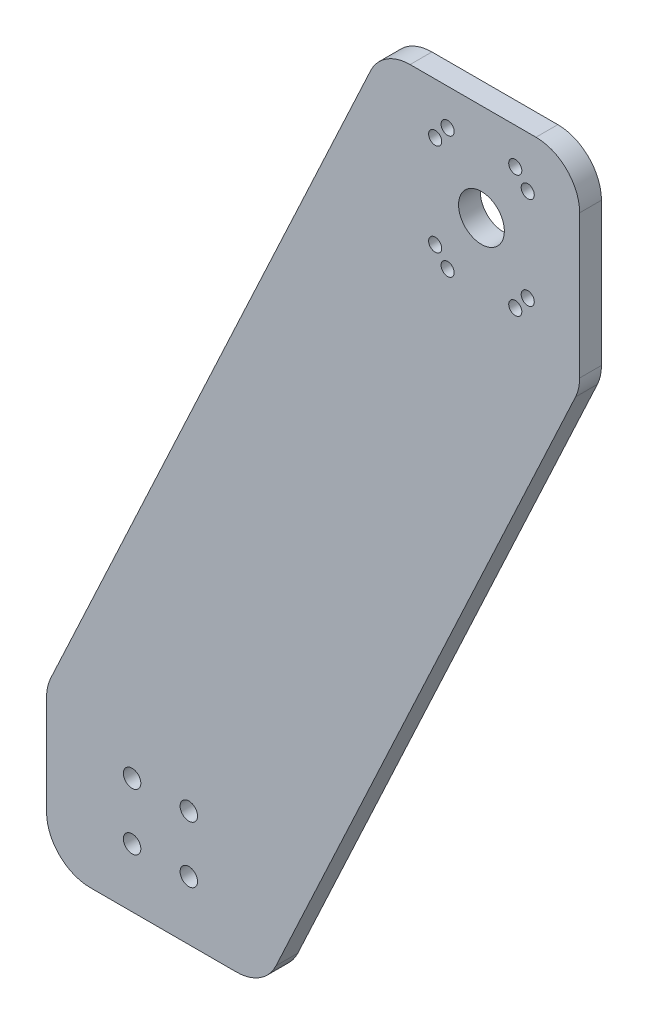
ISO-10303-21;
HEADER;
FILE_DESCRIPTION(('STEP AP214'),'2;1');
FILE_NAME('part.step','',(''),(''),'','','');
FILE_SCHEMA(('AUTOMOTIVE_DESIGN { 1 0 10303 214 1 1 1 1 }'));
ENDSEC;
DATA;
#1=APPLICATION_CONTEXT('core data for automotive mechanical design processes');
#2=APPLICATION_PROTOCOL_DEFINITION('international standard','automotive_design',2000,#1);
#3=PRODUCT_CONTEXT('',#1,'mechanical');
#4=PRODUCT('Part','Part','',(#3));
#5=PRODUCT_RELATED_PRODUCT_CATEGORY('part','',(#4));
#6=PRODUCT_DEFINITION_FORMATION('','',#4);
#7=PRODUCT_DEFINITION_CONTEXT('part definition',#1,'design');
#8=PRODUCT_DEFINITION('design','',#6,#7);
#9=PRODUCT_DEFINITION_SHAPE('','',#8);
#10=(LENGTH_UNIT() NAMED_UNIT(*) SI_UNIT(.MILLI.,.METRE.));
#11=(NAMED_UNIT(*) PLANE_ANGLE_UNIT() SI_UNIT($,.RADIAN.));
#12=(NAMED_UNIT(*) SI_UNIT($,.STERADIAN.) SOLID_ANGLE_UNIT());
#13=UNCERTAINTY_MEASURE_WITH_UNIT(LENGTH_MEASURE(1.E-05),#10,'distance_accuracy_value','');
#14=(GEOMETRIC_REPRESENTATION_CONTEXT(3) GLOBAL_UNCERTAINTY_ASSIGNED_CONTEXT((#13)) GLOBAL_UNIT_ASSIGNED_CONTEXT((#10,
#11,#12)) REPRESENTATION_CONTEXT('',''));
#15=CARTESIAN_POINT('',(0.,0.,0.));
#16=DIRECTION('',(0.,0.,1.));
#17=DIRECTION('',(1.,0.,0.));
#18=AXIS2_PLACEMENT_3D('',#15,#16,#17);
#19=CARTESIAN_POINT('',(87.0224089884993,20.,-10.));
#20=DIRECTION('',(0.,0.,1.));
#21=DIRECTION('',(1.,0.,0.));
#22=AXIS2_PLACEMENT_3D('',#19,#20,#21);
#23=CYLINDRICAL_SURFACE('',#22,20.);
#24=CARTESIAN_POINT('',(87.0224089884993,20.,0.));
#25=DIRECTION('',(0.,0.,1.));
#26=DIRECTION('',(-1.,0.,0.));
#27=AXIS2_PLACEMENT_3D('',#24,#25,#26);
#28=CIRCLE('',#27,20.);
#29=CARTESIAN_POINT('',(87.0224089884993,0.,0.));
#30=VERTEX_POINT('',#29);
#31=CARTESIAN_POINT('',(105.148564729232,11.5476347651861,0.));
#32=VERTEX_POINT('',#31);
#33=EDGE_CURVE('E153',#30,#32,#28,.T.);
#34=ORIENTED_EDGE('',*,*,#33,.F.);
#35=DIRECTION('',(0.,0.,1.));
#36=VECTOR('',#35,1.);
#37=CARTESIAN_POINT('',(87.0224089884993,0.,-10.));
#38=LINE('',#37,#36);
#39=CARTESIAN_POINT('',(87.0224089884993,0.,-10.));
#40=VERTEX_POINT('',#39);
#41=EDGE_CURVE('E11',#40,#30,#38,.T.);
#42=ORIENTED_EDGE('',*,*,#41,.F.);
#43=CARTESIAN_POINT('',(87.0224089884993,20.,-10.));
#44=DIRECTION('',(0.,0.,1.));
#45=DIRECTION('',(-1.,0.,0.));
#46=AXIS2_PLACEMENT_3D('',#43,#44,#45);
#47=CIRCLE('',#46,20.);
#48=CARTESIAN_POINT('',(105.148564729232,11.5476347651861,-10.));
#49=VERTEX_POINT('',#48);
#50=EDGE_CURVE('E186',#40,#49,#47,.T.);
#51=ORIENTED_EDGE('',*,*,#50,.T.);
#52=DIRECTION('',(0.,0.,1.));
#53=VECTOR('',#52,1.);
#54=CARTESIAN_POINT('',(105.148564729232,11.5476347651861,-10.));
#55=LINE('',#54,#53);
#56=EDGE_CURVE('E35',#49,#32,#55,.T.);
#57=ORIENTED_EDGE('',*,*,#56,.T.);
#58=EDGE_LOOP('',(#34,#42,#51,#57));
#59=FACE_BOUND('',#58,.T.);
#60=ADVANCED_FACE('F32',(#59),#23,.T.);
#61=CARTESIAN_POINT('',(20.,0.,-10.));
#62=DIRECTION('',(0.,-1.,0.));
#63=DIRECTION('',(1.,0.,0.));
#64=AXIS2_PLACEMENT_3D('',#61,#62,#63);
#65=PLANE('',#64);
#66=CARTESIAN_POINT('',(26.0112044942496,0.,-5.));
#67=DIRECTION('',(0.,-1.,0.));
#68=DIRECTION('',(-1.,0.,0.));
#69=AXIS2_PLACEMENT_3D('',#66,#67,#68);
#70=CIRCLE('',#69,2.);
#71=CARTESIAN_POINT('',(24.0112044942496,0.,-5.));
#72=VERTEX_POINT('',#71);
#73=EDGE_CURVE('E342',#72,#72,#70,.T.);
#74=ORIENTED_EDGE('',*,*,#73,.F.);
#75=EDGE_LOOP('',(#74));
#76=FACE_BOUND('',#75,.T.);
#77=CARTESIAN_POINT('',(81.0112044942496,0.,-5.));
#78=DIRECTION('',(0.,-1.,0.));
#79=DIRECTION('',(1.,0.,0.));
#80=AXIS2_PLACEMENT_3D('',#77,#78,#79);
#81=CIRCLE('',#80,2.);
#82=CARTESIAN_POINT('',(83.0112044942496,0.,-5.));
#83=VERTEX_POINT('',#82);
#84=EDGE_CURVE('E341',#83,#83,#81,.T.);
#85=ORIENTED_EDGE('',*,*,#84,.F.);
#86=EDGE_LOOP('',(#85));
#87=FACE_BOUND('',#86,.T.);
#88=CARTESIAN_POINT('',(53.5112044942496,0.,-5.));
#89=DIRECTION('',(0.,-1.,0.));
#90=DIRECTION('',(1.,0.,0.));
#91=AXIS2_PLACEMENT_3D('',#88,#89,#90);
#92=CIRCLE('',#91,2.);
#93=CARTESIAN_POINT('',(55.5112044942496,0.,-5.));
#94=VERTEX_POINT('',#93);
#95=EDGE_CURVE('E351',#94,#94,#92,.T.);
#96=ORIENTED_EDGE('',*,*,#95,.F.);
#97=EDGE_LOOP('',(#96));
#98=FACE_BOUND('',#97,.T.);
#99=DIRECTION('',(1.,0.,0.));
#100=VECTOR('',#99,1.);
#101=CARTESIAN_POINT('',(20.,0.,0.));
#102=LINE('',#101,#100);
#103=CARTESIAN_POINT('',(20.,0.,0.));
#104=VERTEX_POINT('',#103);
#105=EDGE_CURVE('E184',#104,#30,#102,.T.);
#106=ORIENTED_EDGE('',*,*,#105,.F.);
#107=DIRECTION('',(0.,0.,1.));
#108=VECTOR('',#107,1.);
#109=CARTESIAN_POINT('',(20.,0.,-10.));
#110=LINE('',#109,#108);
#111=CARTESIAN_POINT('',(20.,0.,-10.));
#112=VERTEX_POINT('',#111);
#113=EDGE_CURVE('E41',#112,#104,#110,.T.);
#114=ORIENTED_EDGE('',*,*,#113,.F.);
#115=DIRECTION('',(1.,0.,0.));
#116=VECTOR('',#115,1.);
#117=CARTESIAN_POINT('',(20.,0.,-10.));
#118=LINE('',#117,#116);
#119=EDGE_CURVE('E143',#112,#40,#118,.T.);
#120=ORIENTED_EDGE('',*,*,#119,.T.);
#121=ORIENTED_EDGE('',*,*,#41,.T.);
#122=EDGE_LOOP('',(#106,#114,#120,#121));
#123=FACE_BOUND('',#122,.T.);
#124=ADVANCED_FACE('F206',(#76,#87,#98,#123),#65,.T.);
#125=CARTESIAN_POINT('',(20.,20.,-10.));
#126=DIRECTION('',(0.,0.,1.));
#127=DIRECTION('',(1.,0.,0.));
#128=AXIS2_PLACEMENT_3D('',#125,#126,#127);
#129=CYLINDRICAL_SURFACE('',#128,20.);
#130=CARTESIAN_POINT('',(20.,20.,0.));
#131=DIRECTION('',(0.,0.,1.));
#132=DIRECTION('',(-1.,0.,0.));
#133=AXIS2_PLACEMENT_3D('',#130,#131,#132);
#134=CIRCLE('',#133,20.);
#135=CARTESIAN_POINT('',(0.,20.,0.));
#136=VERTEX_POINT('',#135);
#137=EDGE_CURVE('E130',#136,#104,#134,.T.);
#138=ORIENTED_EDGE('',*,*,#137,.F.);
#139=DIRECTION('',(0.,0.,1.));
#140=VECTOR('',#139,1.);
#141=CARTESIAN_POINT('',(0.,20.,-10.));
#142=LINE('',#141,#140);
#143=CARTESIAN_POINT('',(0.,20.,-10.));
#144=VERTEX_POINT('',#143);
#145=EDGE_CURVE('E125',#144,#136,#142,.T.);
#146=ORIENTED_EDGE('',*,*,#145,.F.);
#147=CARTESIAN_POINT('',(20.,20.,-10.));
#148=DIRECTION('',(0.,0.,1.));
#149=DIRECTION('',(-1.,0.,0.));
#150=AXIS2_PLACEMENT_3D('',#147,#148,#149);
#151=CIRCLE('',#150,20.);
#152=EDGE_CURVE('E128',#144,#112,#151,.T.);
#153=ORIENTED_EDGE('',*,*,#152,.T.);
#154=ORIENTED_EDGE('',*,*,#113,.T.);
#155=EDGE_LOOP('',(#138,#146,#153,#154));
#156=FACE_BOUND('',#155,.T.);
#157=ADVANCED_FACE('F127',(#156),#129,.T.);
#158=CARTESIAN_POINT('',(0.,65.5661067471412,-10.));
#159=DIRECTION('',(-1.,0.,0.));
#160=DIRECTION('',(0.,-1.,0.));
#161=AXIS2_PLACEMENT_3D('',#158,#159,#160);
#162=PLANE('',#161);
#163=DIRECTION('',(0.,-1.,0.));
#164=VECTOR('',#163,1.);
#165=CARTESIAN_POINT('',(0.,65.5661067471412,0.));
#166=LINE('',#165,#164);
#167=CARTESIAN_POINT('',(0.,65.5661067471412,0.));
#168=VERTEX_POINT('',#167);
#169=EDGE_CURVE('E181',#168,#136,#166,.T.);
#170=ORIENTED_EDGE('',*,*,#169,.F.);
#171=DIRECTION('',(0.,0.,1.));
#172=VECTOR('',#171,1.);
#173=CARTESIAN_POINT('',(0.,65.5661067471412,-10.));
#174=LINE('',#173,#172);
#175=CARTESIAN_POINT('',(0.,65.5661067471412,-10.));
#176=VERTEX_POINT('',#175);
#177=EDGE_CURVE('E135',#176,#168,#174,.T.);
#178=ORIENTED_EDGE('',*,*,#177,.F.);
#179=DIRECTION('',(0.,-1.,0.));
#180=VECTOR('',#179,1.);
#181=CARTESIAN_POINT('',(0.,65.5661067471412,-10.));
#182=LINE('',#181,#180);
#183=EDGE_CURVE('E141',#176,#144,#182,.T.);
#184=ORIENTED_EDGE('',*,*,#183,.T.);
#185=ORIENTED_EDGE('',*,*,#145,.T.);
#186=EDGE_LOOP('',(#170,#178,#184,#185));
#187=FACE_BOUND('',#186,.T.);
#188=ADVANCED_FACE('F145',(#187),#162,.T.);
#189=CARTESIAN_POINT('',(20.,65.5661067471412,-10.));
#190=DIRECTION('',(0.,0.,1.));
#191=DIRECTION('',(1.,0.,0.));
#192=AXIS2_PLACEMENT_3D('',#189,#190,#191);
#193=CYLINDRICAL_SURFACE('',#192,20.);
#194=CARTESIAN_POINT('',(20.,65.5661067471412,0.));
#195=DIRECTION('',(0.,0.,1.));
#196=DIRECTION('',(-1.,0.,0.));
#197=AXIS2_PLACEMENT_3D('',#194,#195,#196);
#198=CIRCLE('',#197,20.);
#199=CARTESIAN_POINT('',(1.873844259267,74.0184719819552,0.));
#200=VERTEX_POINT('',#199);
#201=EDGE_CURVE('E178',#200,#168,#198,.T.);
#202=ORIENTED_EDGE('',*,*,#201,.F.);
#203=DIRECTION('',(0.,0.,1.));
#204=VECTOR('',#203,1.);
#205=CARTESIAN_POINT('',(1.873844259267,74.0184719819552,-10.));
#206=LINE('',#205,#204);
#207=CARTESIAN_POINT('',(1.873844259267,74.0184719819552,-10.));
#208=VERTEX_POINT('',#207);
#209=EDGE_CURVE('E190',#208,#200,#206,.T.);
#210=ORIENTED_EDGE('',*,*,#209,.F.);
#211=CARTESIAN_POINT('',(20.,65.5661067471412,-10.));
#212=DIRECTION('',(0.,0.,1.));
#213=DIRECTION('',(-1.,0.,0.));
#214=AXIS2_PLACEMENT_3D('',#211,#212,#213);
#215=CIRCLE('',#214,20.);
#216=EDGE_CURVE('E146',#208,#176,#215,.T.);
#217=ORIENTED_EDGE('',*,*,#216,.T.);
#218=ORIENTED_EDGE('',*,*,#177,.T.);
#219=EDGE_LOOP('',(#202,#210,#217,#218));
#220=FACE_BOUND('',#219,.T.);
#221=ADVANCED_FACE('F222',(#220),#193,.T.);
#222=CARTESIAN_POINT('',(148.496776666565,388.452365234814,-10.));
#223=DIRECTION('',(-0.906307787036651,0.422618261740697,0.));
#224=DIRECTION('',(-0.422618261740697,-0.906307787036651,0.));
#225=AXIS2_PLACEMENT_3D('',#222,#223,#224);
#226=PLANE('',#225);
#227=DIRECTION('',(-0.422618261740697,-0.906307787036651,0.));
#228=VECTOR('',#227,1.);
#229=CARTESIAN_POINT('',(148.496776666565,388.452365234814,0.));
#230=LINE('',#229,#228);
#231=CARTESIAN_POINT('',(148.496776666565,388.452365234814,0.));
#232=VERTEX_POINT('',#231);
#233=EDGE_CURVE('E175',#232,#200,#230,.T.);
#234=ORIENTED_EDGE('',*,*,#233,.F.);
#235=DIRECTION('',(0.,0.,1.));
#236=VECTOR('',#235,1.);
#237=CARTESIAN_POINT('',(148.496776666565,388.452365234814,-10.));
#238=LINE('',#237,#236);
#239=CARTESIAN_POINT('',(148.496776666565,388.452365234814,-10.));
#240=VERTEX_POINT('',#239);
#241=EDGE_CURVE('E192',#240,#232,#238,.T.);
#242=ORIENTED_EDGE('',*,*,#241,.F.);
#243=DIRECTION('',(-0.422618261740697,-0.906307787036651,0.));
#244=VECTOR('',#243,1.);
#245=CARTESIAN_POINT('',(148.496776666565,388.452365234814,-10.));
#246=LINE('',#245,#244);
#247=EDGE_CURVE('E148',#240,#208,#246,.T.);
#248=ORIENTED_EDGE('',*,*,#247,.T.);
#249=ORIENTED_EDGE('',*,*,#209,.T.);
#250=EDGE_LOOP('',(#234,#242,#248,#249));
#251=FACE_BOUND('',#250,.T.);
#252=ADVANCED_FACE('F225',(#251),#226,.T.);
#253=CARTESIAN_POINT('',(166.622932407298,380.,-10.));
#254=DIRECTION('',(0.,0.,1.));
#255=DIRECTION('',(1.,0.,0.));
#256=AXIS2_PLACEMENT_3D('',#253,#254,#255);
#257=CYLINDRICAL_SURFACE('',#256,20.0000000000001);
#258=CARTESIAN_POINT('',(166.622932407298,380.,0.));
#259=DIRECTION('',(0.,0.,1.));
#260=DIRECTION('',(1.,0.,0.));
#261=AXIS2_PLACEMENT_3D('',#258,#259,#260);
#262=CIRCLE('',#261,20.0000000000001);
#263=CARTESIAN_POINT('',(166.622932407298,400.,0.));
#264=VERTEX_POINT('',#263);
#265=EDGE_CURVE('E172',#264,#232,#262,.T.);
#266=ORIENTED_EDGE('',*,*,#265,.F.);
#267=DIRECTION('',(0.,0.,1.));
#268=VECTOR('',#267,1.);
#269=CARTESIAN_POINT('',(166.622932407298,400.,-10.));
#270=LINE('',#269,#268);
#271=CARTESIAN_POINT('',(166.622932407298,400.,-10.));
#272=VERTEX_POINT('',#271);
#273=EDGE_CURVE('E194',#272,#264,#270,.T.);
#274=ORIENTED_EDGE('',*,*,#273,.F.);
#275=CARTESIAN_POINT('',(166.622932407298,380.,-10.));
#276=DIRECTION('',(0.,0.,1.));
#277=DIRECTION('',(1.,0.,0.));
#278=AXIS2_PLACEMENT_3D('',#275,#276,#277);
#279=CIRCLE('',#278,20.0000000000001);
#280=EDGE_CURVE('E449',#272,#240,#279,.T.);
#281=ORIENTED_EDGE('',*,*,#280,.T.);
#282=ORIENTED_EDGE('',*,*,#241,.T.);
#283=EDGE_LOOP('',(#266,#274,#281,#282));
#284=FACE_BOUND('',#283,.T.);
#285=ADVANCED_FACE('F229',(#284),#257,.T.);
#286=CARTESIAN_POINT('',(224.319188232698,400.,-10.));
#287=DIRECTION('',(0.,1.,0.));
#288=DIRECTION('',(-1.,0.,0.));
#289=AXIS2_PLACEMENT_3D('',#286,#287,#288);
#290=PLANE('',#289);
#291=DIRECTION('',(-1.,0.,0.));
#292=VECTOR('',#291,1.);
#293=CARTESIAN_POINT('',(224.319188232698,400.,0.));
#294=LINE('',#293,#292);
#295=CARTESIAN_POINT('',(224.319188232698,400.,0.));
#296=VERTEX_POINT('',#295);
#297=EDGE_CURVE('E169',#296,#264,#294,.T.);
#298=ORIENTED_EDGE('',*,*,#297,.F.);
#299=DIRECTION('',(0.,0.,1.));
#300=VECTOR('',#299,1.);
#301=CARTESIAN_POINT('',(224.319188232698,400.,-10.));
#302=LINE('',#301,#300);
#303=CARTESIAN_POINT('',(224.319188232698,400.,-10.));
#304=VERTEX_POINT('',#303);
#305=EDGE_CURVE('E196',#304,#296,#302,.T.);
#306=ORIENTED_EDGE('',*,*,#305,.F.);
#307=DIRECTION('',(-1.,0.,0.));
#308=VECTOR('',#307,1.);
#309=CARTESIAN_POINT('',(224.319188232698,400.,-10.));
#310=LINE('',#309,#308);
#311=EDGE_CURVE('E446',#304,#272,#310,.T.);
#312=ORIENTED_EDGE('',*,*,#311,.T.);
#313=ORIENTED_EDGE('',*,*,#273,.T.);
#314=EDGE_LOOP('',(#298,#306,#312,#313));
#315=FACE_BOUND('',#314,.T.);
#316=ADVANCED_FACE('F233',(#315),#290,.T.);
#317=CARTESIAN_POINT('',(224.319188232698,380.,-10.));
#318=DIRECTION('',(0.,0.,1.));
#319=DIRECTION('',(1.,0.,0.));
#320=AXIS2_PLACEMENT_3D('',#317,#318,#319);
#321=CYLINDRICAL_SURFACE('',#320,20.);
#322=CARTESIAN_POINT('',(224.319188232698,380.,0.));
#323=DIRECTION('',(0.,0.,1.));
#324=DIRECTION('',(1.,0.,0.));
#325=AXIS2_PLACEMENT_3D('',#322,#323,#324);
#326=CIRCLE('',#325,20.);
#327=CARTESIAN_POINT('',(244.319188232698,380.,0.));
#328=VERTEX_POINT('',#327);
#329=EDGE_CURVE('E166',#328,#296,#326,.T.);
#330=ORIENTED_EDGE('',*,*,#329,.F.);
#331=DIRECTION('',(0.,0.,1.));
#332=VECTOR('',#331,1.);
#333=CARTESIAN_POINT('',(244.319188232698,380.,-10.));
#334=LINE('',#333,#332);
#335=CARTESIAN_POINT('',(244.319188232698,380.,-10.));
#336=VERTEX_POINT('',#335);
#337=EDGE_CURVE('E198',#336,#328,#334,.T.);
#338=ORIENTED_EDGE('',*,*,#337,.F.);
#339=CARTESIAN_POINT('',(224.319188232698,380.,-10.));
#340=DIRECTION('',(0.,0.,1.));
#341=DIRECTION('',(1.,0.,0.));
#342=AXIS2_PLACEMENT_3D('',#339,#340,#341);
#343=CIRCLE('',#342,20.);
#344=EDGE_CURVE('E443',#336,#304,#343,.T.);
#345=ORIENTED_EDGE('',*,*,#344,.T.);
#346=ORIENTED_EDGE('',*,*,#305,.T.);
#347=EDGE_LOOP('',(#330,#338,#345,#346));
#348=FACE_BOUND('',#347,.T.);
#349=ADVANCED_FACE('F237',(#348),#321,.T.);
#350=CARTESIAN_POINT('',(244.319188232698,314.433893252859,-10.));
#351=DIRECTION('',(1.,0.,0.));
#352=DIRECTION('',(0.,0.,-1.));
#353=AXIS2_PLACEMENT_3D('',#350,#351,#352);
#354=PLANE('',#353);
#355=DIRECTION('',(0.,1.,0.));
#356=VECTOR('',#355,1.);
#357=CARTESIAN_POINT('',(244.319188232698,314.433893252859,0.));
#358=LINE('',#357,#356);
#359=CARTESIAN_POINT('',(244.319188232698,314.433893252859,0.));
#360=VERTEX_POINT('',#359);
#361=EDGE_CURVE('E163',#360,#328,#358,.T.);
#362=ORIENTED_EDGE('',*,*,#361,.F.);
#363=DIRECTION('',(0.,0.,1.));
#364=VECTOR('',#363,1.);
#365=CARTESIAN_POINT('',(244.319188232698,314.433893252859,-10.));
#366=LINE('',#365,#364);
#367=CARTESIAN_POINT('',(244.319188232698,314.433893252859,-10.));
#368=VERTEX_POINT('',#367);
#369=EDGE_CURVE('E200',#368,#360,#366,.T.);
#370=ORIENTED_EDGE('',*,*,#369,.F.);
#371=DIRECTION('',(0.,1.,0.));
#372=VECTOR('',#371,1.);
#373=CARTESIAN_POINT('',(244.319188232698,314.433893252859,-10.));
#374=LINE('',#373,#372);
#375=EDGE_CURVE('E440',#368,#336,#374,.T.);
#376=ORIENTED_EDGE('',*,*,#375,.T.);
#377=ORIENTED_EDGE('',*,*,#337,.T.);
#378=EDGE_LOOP('',(#362,#370,#376,#377));
#379=FACE_BOUND('',#378,.T.);
#380=ADVANCED_FACE('F241',(#379),#354,.T.);
#381=CARTESIAN_POINT('',(224.319188232698,314.433893252859,-10.));
#382=DIRECTION('',(0.,0.,1.));
#383=DIRECTION('',(1.,0.,0.));
#384=AXIS2_PLACEMENT_3D('',#381,#382,#383);
#385=CYLINDRICAL_SURFACE('',#384,20.);
#386=CARTESIAN_POINT('',(224.319188232698,314.433893252859,0.));
#387=DIRECTION('',(0.,0.,1.));
#388=DIRECTION('',(-1.,0.,0.));
#389=AXIS2_PLACEMENT_3D('',#386,#387,#388);
#390=CIRCLE('',#389,20.);
#391=CARTESIAN_POINT('',(242.445343973431,305.981528018045,0.));
#392=VERTEX_POINT('',#391);
#393=EDGE_CURVE('E160',#392,#360,#390,.T.);
#394=ORIENTED_EDGE('',*,*,#393,.F.);
#395=DIRECTION('',(0.,0.,1.));
#396=VECTOR('',#395,1.);
#397=CARTESIAN_POINT('',(242.445343973431,305.981528018045,-10.));
#398=LINE('',#397,#396);
#399=CARTESIAN_POINT('',(242.445343973431,305.981528018045,-10.));
#400=VERTEX_POINT('',#399);
#401=EDGE_CURVE('E201',#400,#392,#398,.T.);
#402=ORIENTED_EDGE('',*,*,#401,.F.);
#403=CARTESIAN_POINT('',(224.319188232698,314.433893252859,-10.));
#404=DIRECTION('',(0.,0.,1.));
#405=DIRECTION('',(-1.,0.,0.));
#406=AXIS2_PLACEMENT_3D('',#403,#404,#405);
#407=CIRCLE('',#406,20.);
#408=EDGE_CURVE('E437',#400,#368,#407,.T.);
#409=ORIENTED_EDGE('',*,*,#408,.T.);
#410=ORIENTED_EDGE('',*,*,#369,.T.);
#411=EDGE_LOOP('',(#394,#402,#409,#410));
#412=FACE_BOUND('',#411,.T.);
#413=ADVANCED_FACE('F245',(#412),#385,.T.);
#414=CARTESIAN_POINT('',(105.148564729232,11.5476347651861,-10.));
#415=DIRECTION('',(0.906307787036651,-0.422618261740697,0.));
#416=DIRECTION('',(0.422618261740697,0.906307787036651,0.));
#417=AXIS2_PLACEMENT_3D('',#414,#415,#416);
#418=PLANE('',#417);
#419=DIRECTION('',(0.422618261740697,0.906307787036651,0.));
#420=VECTOR('',#419,1.);
#421=CARTESIAN_POINT('',(105.148564729232,11.5476347651861,0.));
#422=LINE('',#421,#420);
#423=EDGE_CURVE('E156',#32,#392,#422,.T.);
#424=ORIENTED_EDGE('',*,*,#423,.F.);
#425=ORIENTED_EDGE('',*,*,#56,.F.);
#426=DIRECTION('',(0.422618261740697,0.906307787036651,0.));
#427=VECTOR('',#426,1.);
#428=CARTESIAN_POINT('',(105.148564729232,11.5476347651861,-10.));
#429=LINE('',#428,#427);
#430=EDGE_CURVE('E435',#49,#400,#429,.T.);
#431=ORIENTED_EDGE('',*,*,#430,.T.);
#432=ORIENTED_EDGE('',*,*,#401,.T.);
#433=EDGE_LOOP('',(#424,#425,#431,#432));
#434=FACE_BOUND('',#433,.T.);
#435=ADVANCED_FACE('F203',(#434),#418,.T.);
#436=CARTESIAN_POINT('',(87.0224089884993,20.,-10.));
#437=DIRECTION('',(0.,0.,-1.));
#438=DIRECTION('',(-1.,0.,0.));
#439=AXIS2_PLACEMENT_3D('',#436,#437,#438);
#440=PLANE('',#439);
#441=CARTESIAN_POINT('',(178.105984797101,376.682487001816,-10.));
#442=DIRECTION('',(0.,0.,1.));
#443=DIRECTION('',(1.,0.,0.));
#444=AXIS2_PLACEMENT_3D('',#441,#442,#443);
#445=CIRCLE('',#444,2.99999999999999);
#446=CARTESIAN_POINT('',(181.105984797101,376.682487001816,-10.));
#447=VERTEX_POINT('',#446);
#448=EDGE_CURVE('E359',#447,#447,#445,.T.);
#449=ORIENTED_EDGE('',*,*,#448,.T.);
#450=EDGE_LOOP('',(#449));
#451=FACE_BOUND('',#450,.T.);
#452=CARTESIAN_POINT('',(178.105984797101,334.256080130624,-10.));
#453=DIRECTION('',(0.,0.,1.));
#454=DIRECTION('',(1.,0.,0.));
#455=AXIS2_PLACEMENT_3D('',#452,#453,#454);
#456=CIRCLE('',#455,2.99999999999999);
#457=CARTESIAN_POINT('',(181.105984797101,334.256080130624,-10.));
#458=VERTEX_POINT('',#457);
#459=EDGE_CURVE('E364',#458,#458,#456,.T.);
#460=ORIENTED_EDGE('',*,*,#459,.T.);
#461=EDGE_LOOP('',(#460));
#462=FACE_BOUND('',#461,.T.);
#463=CARTESIAN_POINT('',(183.819188232698,327.46928356622,-10.));
#464=DIRECTION('',(0.,0.,1.));
#465=DIRECTION('',(1.,0.,0.));
#466=AXIS2_PLACEMENT_3D('',#463,#464,#465);
#467=CIRCLE('',#466,2.99999999999999);
#468=CARTESIAN_POINT('',(186.819188232698,327.46928356622,-10.));
#469=VERTEX_POINT('',#468);
#470=EDGE_CURVE('E370',#469,#469,#467,.T.);
#471=ORIENTED_EDGE('',*,*,#470,.T.);
#472=EDGE_LOOP('',(#471));
#473=FACE_BOUND('',#472,.T.);
#474=CARTESIAN_POINT('',(214.819188232698,327.46928356622,-10.));
#475=DIRECTION('',(0.,0.,1.));
#476=DIRECTION('',(1.,0.,0.));
#477=AXIS2_PLACEMENT_3D('',#474,#475,#476);
#478=CIRCLE('',#477,2.99999999999999);
#479=CARTESIAN_POINT('',(217.819188232698,327.46928356622,-10.));
#480=VERTEX_POINT('',#479);
#481=EDGE_CURVE('E376',#480,#480,#478,.T.);
#482=ORIENTED_EDGE('',*,*,#481,.T.);
#483=EDGE_LOOP('',(#482));
#484=FACE_BOUND('',#483,.T.);
#485=CARTESIAN_POINT('',(220.532391668294,334.256080130624,-10.));
#486=DIRECTION('',(0.,0.,1.));
#487=DIRECTION('',(1.,0.,0.));
#488=AXIS2_PLACEMENT_3D('',#485,#486,#487);
#489=CIRCLE('',#488,2.99999999999999);
#490=CARTESIAN_POINT('',(223.532391668294,334.256080130624,-10.));
#491=VERTEX_POINT('',#490);
#492=EDGE_CURVE('E382',#491,#491,#489,.T.);
#493=ORIENTED_EDGE('',*,*,#492,.T.);
#494=EDGE_LOOP('',(#493));
#495=FACE_BOUND('',#494,.T.);
#496=CARTESIAN_POINT('',(220.532391668294,376.682487001816,-10.));
#497=DIRECTION('',(0.,0.,1.));
#498=DIRECTION('',(1.,0.,0.));
#499=AXIS2_PLACEMENT_3D('',#496,#497,#498);
#500=CIRCLE('',#499,2.99999999999999);
#501=CARTESIAN_POINT('',(223.532391668294,376.682487001816,-10.));
#502=VERTEX_POINT('',#501);
#503=EDGE_CURVE('E388',#502,#502,#500,.T.);
#504=ORIENTED_EDGE('',*,*,#503,.T.);
#505=EDGE_LOOP('',(#504));
#506=FACE_BOUND('',#505,.T.);
#507=CARTESIAN_POINT('',(214.819188232698,383.46928356622,-10.));
#508=DIRECTION('',(0.,0.,1.));
#509=DIRECTION('',(1.,0.,0.));
#510=AXIS2_PLACEMENT_3D('',#507,#508,#509);
#511=CIRCLE('',#510,2.99999999999999);
#512=CARTESIAN_POINT('',(217.819188232698,383.46928356622,-10.));
#513=VERTEX_POINT('',#512);
#514=EDGE_CURVE('E394',#513,#513,#511,.T.);
#515=ORIENTED_EDGE('',*,*,#514,.T.);
#516=EDGE_LOOP('',(#515));
#517=FACE_BOUND('',#516,.T.);
#518=CARTESIAN_POINT('',(183.819188232698,383.46928356622,-10.));
#519=DIRECTION('',(0.,0.,1.));
#520=DIRECTION('',(1.,0.,0.));
#521=AXIS2_PLACEMENT_3D('',#518,#519,#520);
#522=CIRCLE('',#521,2.99999999999999);
#523=CARTESIAN_POINT('',(186.819188232698,383.46928356622,-10.));
#524=VERTEX_POINT('',#523);
#525=EDGE_CURVE('E400',#524,#524,#522,.T.);
#526=ORIENTED_EDGE('',*,*,#525,.T.);
#527=EDGE_LOOP('',(#526));
#528=FACE_BOUND('',#527,.T.);
#529=CARTESIAN_POINT('',(199.319188232698,355.46928356622,-10.));
#530=DIRECTION('',(0.,0.,1.));
#531=DIRECTION('',(1.,0.,0.));
#532=AXIS2_PLACEMENT_3D('',#529,#530,#531);
#533=CIRCLE('',#532,10.5);
#534=CARTESIAN_POINT('',(209.819188232698,355.46928356622,-10.));
#535=VERTEX_POINT('',#534);
#536=EDGE_CURVE('E406',#535,#535,#533,.T.);
#537=ORIENTED_EDGE('',*,*,#536,.T.);
#538=EDGE_LOOP('',(#537));
#539=FACE_BOUND('',#538,.T.);
#540=CARTESIAN_POINT('',(39.2134453930995,27.,-10.));
#541=DIRECTION('',(0.,0.,1.));
#542=DIRECTION('',(-1.,0.,0.));
#543=AXIS2_PLACEMENT_3D('',#540,#541,#542);
#544=CIRCLE('',#543,4.00000000000001);
#545=CARTESIAN_POINT('',(35.2134453930995,27.,-10.));
#546=VERTEX_POINT('',#545);
#547=EDGE_CURVE('E412',#546,#546,#544,.T.);
#548=ORIENTED_EDGE('',*,*,#547,.T.);
#549=EDGE_LOOP('',(#548));
#550=FACE_BOUND('',#549,.T.);
#551=CARTESIAN_POINT('',(65.2134453930995,27.,-10.));
#552=DIRECTION('',(0.,0.,1.));
#553=DIRECTION('',(1.,0.,0.));
#554=AXIS2_PLACEMENT_3D('',#551,#552,#553);
#555=CIRCLE('',#554,4.00000000000002);
#556=CARTESIAN_POINT('',(69.2134453930995,27.,-10.));
#557=VERTEX_POINT('',#556);
#558=EDGE_CURVE('E418',#557,#557,#555,.T.);
#559=ORIENTED_EDGE('',*,*,#558,.T.);
#560=EDGE_LOOP('',(#559));
#561=FACE_BOUND('',#560,.T.);
#562=CARTESIAN_POINT('',(65.2134453930995,53.,-10.));
#563=DIRECTION('',(0.,0.,1.));
#564=DIRECTION('',(-1.,0.,0.));
#565=AXIS2_PLACEMENT_3D('',#562,#563,#564);
#566=CIRCLE('',#565,4.00000000000002);
#567=CARTESIAN_POINT('',(61.2134453930995,53.,-10.));
#568=VERTEX_POINT('',#567);
#569=EDGE_CURVE('E424',#568,#568,#566,.T.);
#570=ORIENTED_EDGE('',*,*,#569,.T.);
#571=EDGE_LOOP('',(#570));
#572=FACE_BOUND('',#571,.T.);
#573=CARTESIAN_POINT('',(39.2134453930995,53.,-10.));
#574=DIRECTION('',(0.,0.,1.));
#575=DIRECTION('',(1.,0.,0.));
#576=AXIS2_PLACEMENT_3D('',#573,#574,#575);
#577=CIRCLE('',#576,4.00000000000002);
#578=CARTESIAN_POINT('',(43.2134453930995,53.,-10.));
#579=VERTEX_POINT('',#578);
#580=EDGE_CURVE('E157',#579,#579,#577,.T.);
#581=ORIENTED_EDGE('',*,*,#580,.T.);
#582=EDGE_LOOP('',(#581));
#583=FACE_BOUND('',#582,.T.);
#584=ORIENTED_EDGE('',*,*,#50,.F.);
#585=ORIENTED_EDGE('',*,*,#119,.F.);
#586=ORIENTED_EDGE('',*,*,#152,.F.);
#587=ORIENTED_EDGE('',*,*,#183,.F.);
#588=ORIENTED_EDGE('',*,*,#216,.F.);
#589=ORIENTED_EDGE('',*,*,#247,.F.);
#590=ORIENTED_EDGE('',*,*,#280,.F.);
#591=ORIENTED_EDGE('',*,*,#311,.F.);
#592=ORIENTED_EDGE('',*,*,#344,.F.);
#593=ORIENTED_EDGE('',*,*,#375,.F.);
#594=ORIENTED_EDGE('',*,*,#408,.F.);
#595=ORIENTED_EDGE('',*,*,#430,.F.);
#596=EDGE_LOOP('',(#584,#585,#586,#587,#588,#589,#590,#591,#592,#593,#594,#595));
#597=FACE_BOUND('',#596,.T.);
#598=ADVANCED_FACE('F139',(#451,#462,#473,#484,#495,#506,#517,#528,#539,#550,#561,#572,#583,
#597),#440,.T.);
#599=CARTESIAN_POINT('',(87.0224089884993,20.,0.));
#600=DIRECTION('',(0.,0.,-1.));
#601=DIRECTION('',(-1.,0.,0.));
#602=AXIS2_PLACEMENT_3D('',#599,#600,#601);
#603=PLANE('',#602);
#604=CARTESIAN_POINT('',(178.105984797101,376.682487001816,0.));
#605=DIRECTION('',(0.,0.,1.));
#606=DIRECTION('',(1.,0.,0.));
#607=AXIS2_PLACEMENT_3D('',#604,#605,#606);
#608=CIRCLE('',#607,2.99999999999999);
#609=CARTESIAN_POINT('',(181.105984797101,376.682487001816,0.));
#610=VERTEX_POINT('',#609);
#611=EDGE_CURVE('E356',#610,#610,#608,.T.);
#612=ORIENTED_EDGE('',*,*,#611,.F.);
#613=EDGE_LOOP('',(#612));
#614=FACE_BOUND('',#613,.T.);
#615=CARTESIAN_POINT('',(178.105984797101,334.256080130624,0.));
#616=DIRECTION('',(0.,0.,1.));
#617=DIRECTION('',(1.,0.,0.));
#618=AXIS2_PLACEMENT_3D('',#615,#616,#617);
#619=CIRCLE('',#618,2.99999999999999);
#620=CARTESIAN_POINT('',(181.105984797101,334.256080130624,0.));
#621=VERTEX_POINT('',#620);
#622=EDGE_CURVE('E361',#621,#621,#619,.T.);
#623=ORIENTED_EDGE('',*,*,#622,.F.);
#624=EDGE_LOOP('',(#623));
#625=FACE_BOUND('',#624,.T.);
#626=CARTESIAN_POINT('',(183.819188232698,327.46928356622,0.));
#627=DIRECTION('',(0.,0.,1.));
#628=DIRECTION('',(1.,0.,0.));
#629=AXIS2_PLACEMENT_3D('',#626,#627,#628);
#630=CIRCLE('',#629,2.99999999999999);
#631=CARTESIAN_POINT('',(186.819188232698,327.46928356622,0.));
#632=VERTEX_POINT('',#631);
#633=EDGE_CURVE('E367',#632,#632,#630,.T.);
#634=ORIENTED_EDGE('',*,*,#633,.F.);
#635=EDGE_LOOP('',(#634));
#636=FACE_BOUND('',#635,.T.);
#637=CARTESIAN_POINT('',(214.819188232698,327.46928356622,0.));
#638=DIRECTION('',(0.,0.,1.));
#639=DIRECTION('',(1.,0.,0.));
#640=AXIS2_PLACEMENT_3D('',#637,#638,#639);
#641=CIRCLE('',#640,2.99999999999999);
#642=CARTESIAN_POINT('',(217.819188232698,327.46928356622,0.));
#643=VERTEX_POINT('',#642);
#644=EDGE_CURVE('E373',#643,#643,#641,.T.);
#645=ORIENTED_EDGE('',*,*,#644,.F.);
#646=EDGE_LOOP('',(#645));
#647=FACE_BOUND('',#646,.T.);
#648=CARTESIAN_POINT('',(220.532391668294,334.256080130624,0.));
#649=DIRECTION('',(0.,0.,1.));
#650=DIRECTION('',(1.,0.,0.));
#651=AXIS2_PLACEMENT_3D('',#648,#649,#650);
#652=CIRCLE('',#651,2.99999999999999);
#653=CARTESIAN_POINT('',(223.532391668294,334.256080130624,0.));
#654=VERTEX_POINT('',#653);
#655=EDGE_CURVE('E379',#654,#654,#652,.T.);
#656=ORIENTED_EDGE('',*,*,#655,.F.);
#657=EDGE_LOOP('',(#656));
#658=FACE_BOUND('',#657,.T.);
#659=CARTESIAN_POINT('',(220.532391668294,376.682487001816,0.));
#660=DIRECTION('',(0.,0.,1.));
#661=DIRECTION('',(1.,0.,0.));
#662=AXIS2_PLACEMENT_3D('',#659,#660,#661);
#663=CIRCLE('',#662,2.99999999999999);
#664=CARTESIAN_POINT('',(223.532391668294,376.682487001816,0.));
#665=VERTEX_POINT('',#664);
#666=EDGE_CURVE('E385',#665,#665,#663,.T.);
#667=ORIENTED_EDGE('',*,*,#666,.F.);
#668=EDGE_LOOP('',(#667));
#669=FACE_BOUND('',#668,.T.);
#670=CARTESIAN_POINT('',(214.819188232698,383.46928356622,0.));
#671=DIRECTION('',(0.,0.,1.));
#672=DIRECTION('',(1.,0.,0.));
#673=AXIS2_PLACEMENT_3D('',#670,#671,#672);
#674=CIRCLE('',#673,2.99999999999999);
#675=CARTESIAN_POINT('',(217.819188232698,383.46928356622,0.));
#676=VERTEX_POINT('',#675);
#677=EDGE_CURVE('E391',#676,#676,#674,.T.);
#678=ORIENTED_EDGE('',*,*,#677,.F.);
#679=EDGE_LOOP('',(#678));
#680=FACE_BOUND('',#679,.T.);
#681=CARTESIAN_POINT('',(183.819188232698,383.46928356622,0.));
#682=DIRECTION('',(0.,0.,1.));
#683=DIRECTION('',(1.,0.,0.));
#684=AXIS2_PLACEMENT_3D('',#681,#682,#683);
#685=CIRCLE('',#684,2.99999999999999);
#686=CARTESIAN_POINT('',(186.819188232698,383.46928356622,0.));
#687=VERTEX_POINT('',#686);
#688=EDGE_CURVE('E397',#687,#687,#685,.T.);
#689=ORIENTED_EDGE('',*,*,#688,.F.);
#690=EDGE_LOOP('',(#689));
#691=FACE_BOUND('',#690,.T.);
#692=CARTESIAN_POINT('',(199.319188232698,355.46928356622,0.));
#693=DIRECTION('',(0.,0.,1.));
#694=DIRECTION('',(1.,0.,0.));
#695=AXIS2_PLACEMENT_3D('',#692,#693,#694);
#696=CIRCLE('',#695,10.5);
#697=CARTESIAN_POINT('',(209.819188232698,355.46928356622,0.));
#698=VERTEX_POINT('',#697);
#699=EDGE_CURVE('E403',#698,#698,#696,.T.);
#700=ORIENTED_EDGE('',*,*,#699,.F.);
#701=EDGE_LOOP('',(#700));
#702=FACE_BOUND('',#701,.T.);
#703=CARTESIAN_POINT('',(39.2134453930995,27.,0.));
#704=DIRECTION('',(0.,0.,1.));
#705=DIRECTION('',(-1.,0.,0.));
#706=AXIS2_PLACEMENT_3D('',#703,#704,#705);
#707=CIRCLE('',#706,4.00000000000001);
#708=CARTESIAN_POINT('',(35.2134453930995,27.,0.));
#709=VERTEX_POINT('',#708);
#710=EDGE_CURVE('E409',#709,#709,#707,.T.);
#711=ORIENTED_EDGE('',*,*,#710,.F.);
#712=EDGE_LOOP('',(#711));
#713=FACE_BOUND('',#712,.T.);
#714=CARTESIAN_POINT('',(65.2134453930995,27.,0.));
#715=DIRECTION('',(0.,0.,1.));
#716=DIRECTION('',(1.,0.,0.));
#717=AXIS2_PLACEMENT_3D('',#714,#715,#716);
#718=CIRCLE('',#717,4.00000000000002);
#719=CARTESIAN_POINT('',(69.2134453930995,27.,0.));
#720=VERTEX_POINT('',#719);
#721=EDGE_CURVE('E415',#720,#720,#718,.T.);
#722=ORIENTED_EDGE('',*,*,#721,.F.);
#723=EDGE_LOOP('',(#722));
#724=FACE_BOUND('',#723,.T.);
#725=CARTESIAN_POINT('',(65.2134453930995,53.,0.));
#726=DIRECTION('',(0.,0.,1.));
#727=DIRECTION('',(-1.,0.,0.));
#728=AXIS2_PLACEMENT_3D('',#725,#726,#727);
#729=CIRCLE('',#728,4.00000000000002);
#730=CARTESIAN_POINT('',(61.2134453930995,53.,0.));
#731=VERTEX_POINT('',#730);
#732=EDGE_CURVE('E421',#731,#731,#729,.T.);
#733=ORIENTED_EDGE('',*,*,#732,.F.);
#734=EDGE_LOOP('',(#733));
#735=FACE_BOUND('',#734,.T.);
#736=CARTESIAN_POINT('',(39.2134453930995,53.,0.));
#737=DIRECTION('',(0.,0.,1.));
#738=DIRECTION('',(1.,0.,0.));
#739=AXIS2_PLACEMENT_3D('',#736,#737,#738);
#740=CIRCLE('',#739,4.00000000000002);
#741=CARTESIAN_POINT('',(43.2134453930995,53.,0.));
#742=VERTEX_POINT('',#741);
#743=EDGE_CURVE('E427',#742,#742,#740,.T.);
#744=ORIENTED_EDGE('',*,*,#743,.F.);
#745=EDGE_LOOP('',(#744));
#746=FACE_BOUND('',#745,.T.);
#747=ORIENTED_EDGE('',*,*,#33,.T.);
#748=ORIENTED_EDGE('',*,*,#423,.T.);
#749=ORIENTED_EDGE('',*,*,#393,.T.);
#750=ORIENTED_EDGE('',*,*,#361,.T.);
#751=ORIENTED_EDGE('',*,*,#329,.T.);
#752=ORIENTED_EDGE('',*,*,#297,.T.);
#753=ORIENTED_EDGE('',*,*,#265,.T.);
#754=ORIENTED_EDGE('',*,*,#233,.T.);
#755=ORIENTED_EDGE('',*,*,#201,.T.);
#756=ORIENTED_EDGE('',*,*,#169,.T.);
#757=ORIENTED_EDGE('',*,*,#137,.T.);
#758=ORIENTED_EDGE('',*,*,#105,.T.);
#759=EDGE_LOOP('',(#747,#748,#749,#750,#751,#752,#753,#754,#755,#756,#757,#758));
#760=FACE_BOUND('',#759,.T.);
#761=ADVANCED_FACE('F205',(#614,#625,#636,#647,#658,#669,#680,#691,#702,#713,#724,#735,#746,
#760),#603,.F.);
#762=CARTESIAN_POINT('',(39.2134453930995,53.,-10.));
#763=DIRECTION('',(0.,0.,1.));
#764=DIRECTION('',(1.,0.,0.));
#765=AXIS2_PLACEMENT_3D('',#762,#763,#764);
#766=CYLINDRICAL_SURFACE('',#765,4.00000000000002);
#767=ORIENTED_EDGE('',*,*,#580,.F.);
#768=EDGE_LOOP('',(#767));
#769=FACE_BOUND('',#768,.T.);
#770=ORIENTED_EDGE('',*,*,#743,.T.);
#771=EDGE_LOOP('',(#770));
#772=FACE_BOUND('',#771,.T.);
#773=ADVANCED_FACE('F257',(#769,#772),#766,.F.);
#774=CARTESIAN_POINT('',(65.2134453930995,53.,-10.));
#775=DIRECTION('',(0.,0.,1.));
#776=DIRECTION('',(1.,0.,0.));
#777=AXIS2_PLACEMENT_3D('',#774,#775,#776);
#778=CYLINDRICAL_SURFACE('',#777,4.00000000000002);
#779=ORIENTED_EDGE('',*,*,#569,.F.);
#780=EDGE_LOOP('',(#779));
#781=FACE_BOUND('',#780,.T.);
#782=ORIENTED_EDGE('',*,*,#732,.T.);
#783=EDGE_LOOP('',(#782));
#784=FACE_BOUND('',#783,.T.);
#785=ADVANCED_FACE('F264',(#781,#784),#778,.F.);
#786=CARTESIAN_POINT('',(65.2134453930995,27.,-10.));
#787=DIRECTION('',(0.,0.,1.));
#788=DIRECTION('',(1.,0.,0.));
#789=AXIS2_PLACEMENT_3D('',#786,#787,#788);
#790=CYLINDRICAL_SURFACE('',#789,4.00000000000002);
#791=ORIENTED_EDGE('',*,*,#558,.F.);
#792=EDGE_LOOP('',(#791));
#793=FACE_BOUND('',#792,.T.);
#794=ORIENTED_EDGE('',*,*,#721,.T.);
#795=EDGE_LOOP('',(#794));
#796=FACE_BOUND('',#795,.T.);
#797=ADVANCED_FACE('F268',(#793,#796),#790,.F.);
#798=CARTESIAN_POINT('',(39.2134453930995,27.,-10.));
#799=DIRECTION('',(0.,0.,1.));
#800=DIRECTION('',(1.,0.,0.));
#801=AXIS2_PLACEMENT_3D('',#798,#799,#800);
#802=CYLINDRICAL_SURFACE('',#801,4.00000000000001);
#803=ORIENTED_EDGE('',*,*,#547,.F.);
#804=EDGE_LOOP('',(#803));
#805=FACE_BOUND('',#804,.T.);
#806=ORIENTED_EDGE('',*,*,#710,.T.);
#807=EDGE_LOOP('',(#806));
#808=FACE_BOUND('',#807,.T.);
#809=ADVANCED_FACE('F272',(#805,#808),#802,.F.);
#810=CARTESIAN_POINT('',(199.319188232698,355.46928356622,-10.));
#811=DIRECTION('',(0.,0.,1.));
#812=DIRECTION('',(1.,0.,0.));
#813=AXIS2_PLACEMENT_3D('',#810,#811,#812);
#814=CYLINDRICAL_SURFACE('',#813,10.5);
#815=ORIENTED_EDGE('',*,*,#536,.F.);
#816=EDGE_LOOP('',(#815));
#817=FACE_BOUND('',#816,.T.);
#818=ORIENTED_EDGE('',*,*,#699,.T.);
#819=EDGE_LOOP('',(#818));
#820=FACE_BOUND('',#819,.T.);
#821=ADVANCED_FACE('F276',(#817,#820),#814,.F.);
#822=CARTESIAN_POINT('',(183.819188232698,383.46928356622,-10.));
#823=DIRECTION('',(0.,0.,1.));
#824=DIRECTION('',(1.,0.,0.));
#825=AXIS2_PLACEMENT_3D('',#822,#823,#824);
#826=CYLINDRICAL_SURFACE('',#825,2.99999999999999);
#827=ORIENTED_EDGE('',*,*,#525,.F.);
#828=EDGE_LOOP('',(#827));
#829=FACE_BOUND('',#828,.T.);
#830=ORIENTED_EDGE('',*,*,#688,.T.);
#831=EDGE_LOOP('',(#830));
#832=FACE_BOUND('',#831,.T.);
#833=ADVANCED_FACE('F280',(#829,#832),#826,.F.);
#834=CARTESIAN_POINT('',(214.819188232698,383.46928356622,-10.));
#835=DIRECTION('',(0.,0.,1.));
#836=DIRECTION('',(1.,0.,0.));
#837=AXIS2_PLACEMENT_3D('',#834,#835,#836);
#838=CYLINDRICAL_SURFACE('',#837,2.99999999999999);
#839=ORIENTED_EDGE('',*,*,#514,.F.);
#840=EDGE_LOOP('',(#839));
#841=FACE_BOUND('',#840,.T.);
#842=ORIENTED_EDGE('',*,*,#677,.T.);
#843=EDGE_LOOP('',(#842));
#844=FACE_BOUND('',#843,.T.);
#845=ADVANCED_FACE('F284',(#841,#844),#838,.F.);
#846=CARTESIAN_POINT('',(220.532391668294,376.682487001816,-10.));
#847=DIRECTION('',(0.,0.,1.));
#848=DIRECTION('',(1.,0.,0.));
#849=AXIS2_PLACEMENT_3D('',#846,#847,#848);
#850=CYLINDRICAL_SURFACE('',#849,2.99999999999999);
#851=ORIENTED_EDGE('',*,*,#503,.F.);
#852=EDGE_LOOP('',(#851));
#853=FACE_BOUND('',#852,.T.);
#854=ORIENTED_EDGE('',*,*,#666,.T.);
#855=EDGE_LOOP('',(#854));
#856=FACE_BOUND('',#855,.T.);
#857=ADVANCED_FACE('F288',(#853,#856),#850,.F.);
#858=CARTESIAN_POINT('',(220.532391668294,334.256080130624,-10.));
#859=DIRECTION('',(0.,0.,1.));
#860=DIRECTION('',(1.,0.,0.));
#861=AXIS2_PLACEMENT_3D('',#858,#859,#860);
#862=CYLINDRICAL_SURFACE('',#861,2.99999999999999);
#863=ORIENTED_EDGE('',*,*,#492,.F.);
#864=EDGE_LOOP('',(#863));
#865=FACE_BOUND('',#864,.T.);
#866=ORIENTED_EDGE('',*,*,#655,.T.);
#867=EDGE_LOOP('',(#866));
#868=FACE_BOUND('',#867,.T.);
#869=ADVANCED_FACE('F292',(#865,#868),#862,.F.);
#870=CARTESIAN_POINT('',(214.819188232698,327.46928356622,-10.));
#871=DIRECTION('',(0.,0.,1.));
#872=DIRECTION('',(1.,0.,0.));
#873=AXIS2_PLACEMENT_3D('',#870,#871,#872);
#874=CYLINDRICAL_SURFACE('',#873,2.99999999999999);
#875=ORIENTED_EDGE('',*,*,#481,.F.);
#876=EDGE_LOOP('',(#875));
#877=FACE_BOUND('',#876,.T.);
#878=ORIENTED_EDGE('',*,*,#644,.T.);
#879=EDGE_LOOP('',(#878));
#880=FACE_BOUND('',#879,.T.);
#881=ADVANCED_FACE('F296',(#877,#880),#874,.F.);
#882=CARTESIAN_POINT('',(183.819188232698,327.46928356622,-10.));
#883=DIRECTION('',(0.,0.,1.));
#884=DIRECTION('',(1.,0.,0.));
#885=AXIS2_PLACEMENT_3D('',#882,#883,#884);
#886=CYLINDRICAL_SURFACE('',#885,2.99999999999999);
#887=ORIENTED_EDGE('',*,*,#470,.F.);
#888=EDGE_LOOP('',(#887));
#889=FACE_BOUND('',#888,.T.);
#890=ORIENTED_EDGE('',*,*,#633,.T.);
#891=EDGE_LOOP('',(#890));
#892=FACE_BOUND('',#891,.T.);
#893=ADVANCED_FACE('F300',(#889,#892),#886,.F.);
#894=CARTESIAN_POINT('',(178.105984797101,334.256080130624,-10.));
#895=DIRECTION('',(0.,0.,1.));
#896=DIRECTION('',(1.,0.,0.));
#897=AXIS2_PLACEMENT_3D('',#894,#895,#896);
#898=CYLINDRICAL_SURFACE('',#897,2.99999999999999);
#899=ORIENTED_EDGE('',*,*,#459,.F.);
#900=EDGE_LOOP('',(#899));
#901=FACE_BOUND('',#900,.T.);
#902=ORIENTED_EDGE('',*,*,#622,.T.);
#903=EDGE_LOOP('',(#902));
#904=FACE_BOUND('',#903,.T.);
#905=ADVANCED_FACE('F304',(#901,#904),#898,.F.);
#906=CARTESIAN_POINT('',(178.105984797101,376.682487001816,-10.));
#907=DIRECTION('',(0.,0.,1.));
#908=DIRECTION('',(1.,0.,0.));
#909=AXIS2_PLACEMENT_3D('',#906,#907,#908);
#910=CYLINDRICAL_SURFACE('',#909,2.99999999999999);
#911=ORIENTED_EDGE('',*,*,#448,.F.);
#912=EDGE_LOOP('',(#911));
#913=FACE_BOUND('',#912,.T.);
#914=ORIENTED_EDGE('',*,*,#611,.T.);
#915=EDGE_LOOP('',(#914));
#916=FACE_BOUND('',#915,.T.);
#917=ADVANCED_FACE('F308',(#913,#916),#910,.F.);
#918=CARTESIAN_POINT('',(53.5112044942496,15.,-5.));
#919=DIRECTION('',(0.,-1.,0.));
#920=DIRECTION('',(1.,0.,0.));
#921=AXIS2_PLACEMENT_3D('',#918,#919,#920);
#922=CYLINDRICAL_SURFACE('',#921,2.);
#923=CARTESIAN_POINT('',(53.5112044942496,15.,-5.));
#924=DIRECTION('',(0.,-1.,0.));
#925=DIRECTION('',(1.,0.,0.));
#926=AXIS2_PLACEMENT_3D('',#923,#924,#925);
#927=CIRCLE('',#926,2.);
#928=CARTESIAN_POINT('',(55.5112044942496,15.,-5.));
#929=VERTEX_POINT('',#928);
#930=EDGE_CURVE('E353',#929,#929,#927,.T.);
#931=ORIENTED_EDGE('',*,*,#930,.F.);
#932=EDGE_LOOP('',(#931));
#933=FACE_BOUND('',#932,.T.);
#934=ORIENTED_EDGE('',*,*,#95,.T.);
#935=EDGE_LOOP('',(#934));
#936=FACE_BOUND('',#935,.T.);
#937=ADVANCED_FACE('F312',(#933,#936),#922,.F.);
#938=CARTESIAN_POINT('',(53.5112044942496,15.,-5.));
#939=DIRECTION('',(0.,-1.,0.));
#940=DIRECTION('',(1.,0.,0.));
#941=AXIS2_PLACEMENT_3D('',#938,#939,#940);
#942=PLANE('',#941);
#943=ORIENTED_EDGE('',*,*,#930,.T.);
#944=EDGE_LOOP('',(#943));
#945=FACE_BOUND('',#944,.T.);
#946=ADVANCED_FACE('F316',(#945),#942,.T.);
#947=CARTESIAN_POINT('',(81.0112044942496,15.,-5.));
#948=DIRECTION('',(0.,-1.,0.));
#949=DIRECTION('',(1.,0.,0.));
#950=AXIS2_PLACEMENT_3D('',#947,#948,#949);
#951=CYLINDRICAL_SURFACE('',#950,2.);
#952=CARTESIAN_POINT('',(81.0112044942496,15.,-5.));
#953=DIRECTION('',(0.,-1.,0.));
#954=DIRECTION('',(1.,0.,0.));
#955=AXIS2_PLACEMENT_3D('',#952,#953,#954);
#956=CIRCLE('',#955,2.);
#957=CARTESIAN_POINT('',(83.0112044942496,15.,-5.));
#958=VERTEX_POINT('',#957);
#959=EDGE_CURVE('E345',#958,#958,#956,.T.);
#960=ORIENTED_EDGE('',*,*,#959,.F.);
#961=EDGE_LOOP('',(#960));
#962=FACE_BOUND('',#961,.T.);
#963=ORIENTED_EDGE('',*,*,#84,.T.);
#964=EDGE_LOOP('',(#963));
#965=FACE_BOUND('',#964,.T.);
#966=ADVANCED_FACE('F320',(#962,#965),#951,.F.);
#967=CARTESIAN_POINT('',(81.0112044942496,15.,-5.));
#968=DIRECTION('',(0.,-1.,0.));
#969=DIRECTION('',(1.,0.,0.));
#970=AXIS2_PLACEMENT_3D('',#967,#968,#969);
#971=PLANE('',#970);
#972=ORIENTED_EDGE('',*,*,#959,.T.);
#973=EDGE_LOOP('',(#972));
#974=FACE_BOUND('',#973,.T.);
#975=ADVANCED_FACE('F324',(#974),#971,.T.);
#976=CARTESIAN_POINT('',(26.0112044942496,15.,-5.));
#977=DIRECTION('',(0.,-1.,0.));
#978=DIRECTION('',(1.,0.,0.));
#979=AXIS2_PLACEMENT_3D('',#976,#977,#978);
#980=CYLINDRICAL_SURFACE('',#979,2.);
#981=CARTESIAN_POINT('',(26.0112044942496,15.,-5.));
#982=DIRECTION('',(0.,-1.,0.));
#983=DIRECTION('',(-1.,0.,0.));
#984=AXIS2_PLACEMENT_3D('',#981,#982,#983);
#985=CIRCLE('',#984,2.);
#986=CARTESIAN_POINT('',(24.0112044942496,15.,-5.));
#987=VERTEX_POINT('',#986);
#988=EDGE_CURVE('E340',#987,#987,#985,.T.);
#989=ORIENTED_EDGE('',*,*,#988,.F.);
#990=EDGE_LOOP('',(#989));
#991=FACE_BOUND('',#990,.T.);
#992=ORIENTED_EDGE('',*,*,#73,.T.);
#993=EDGE_LOOP('',(#992));
#994=FACE_BOUND('',#993,.T.);
#995=ADVANCED_FACE('F328',(#991,#994),#980,.F.);
#996=CARTESIAN_POINT('',(26.0112044942496,15.,-5.));
#997=DIRECTION('',(0.,1.,0.));
#998=DIRECTION('',(-1.,0.,0.));
#999=AXIS2_PLACEMENT_3D('',#996,#997,#998);
#1000=PLANE('',#999);
#1001=ORIENTED_EDGE('',*,*,#988,.T.);
#1002=EDGE_LOOP('',(#1001));
#1003=FACE_BOUND('',#1002,.T.);
#1004=ADVANCED_FACE('F332',(#1003),#1000,.F.);
#1005=CLOSED_SHELL('',(#60,#124,#157,#188,#221,#252,#285,#316,#349,#380,#413,#435,#598,#761,
#773,#785,#797,#809,#821,#833,#845,#857,#869,#881,#893,#905,#917,#937,#946,#966,#975,#995,#1004));
#1006=MANIFOLD_SOLID_BREP('B2',#1005);
#1007=ADVANCED_BREP_SHAPE_REPRESENTATION('',(#18,#1006),#14);
#1008=SHAPE_DEFINITION_REPRESENTATION(#9,#1007);
ENDSEC;
END-ISO-10303-21;
